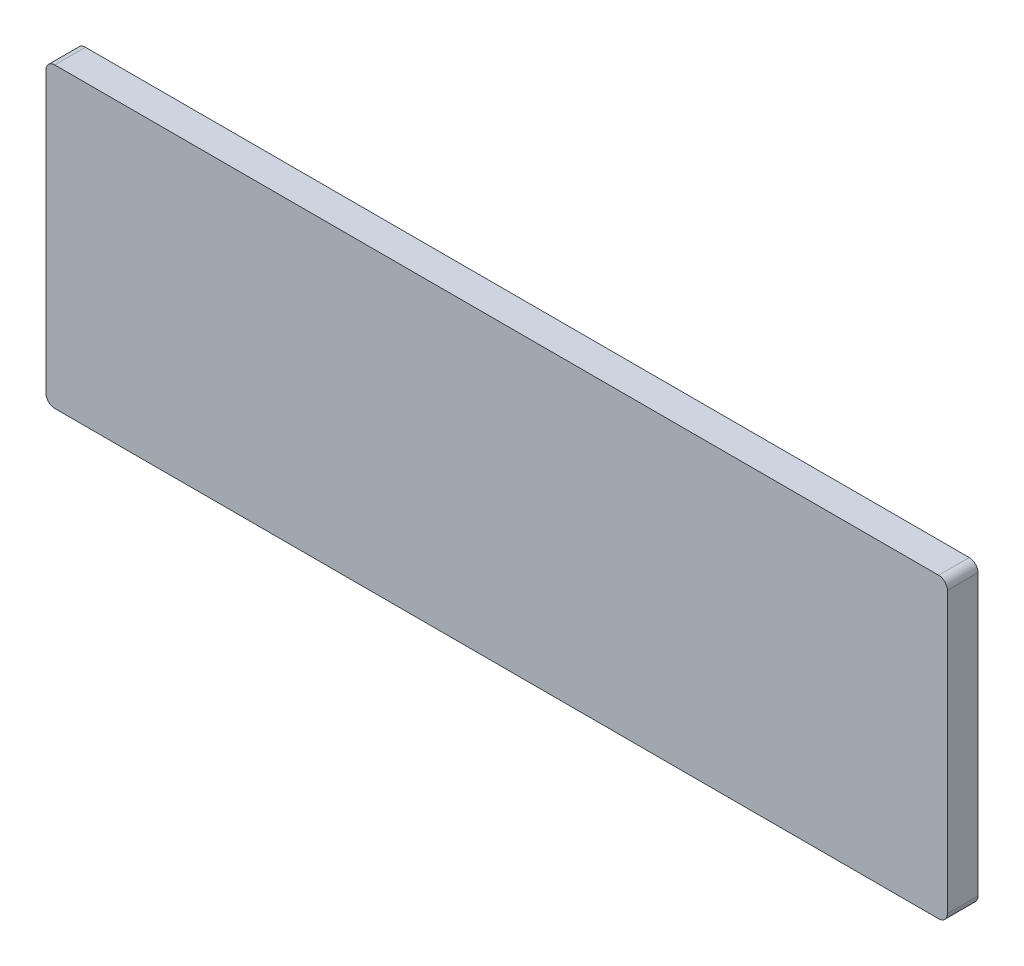
ISO-10303-21;
HEADER;
FILE_DESCRIPTION(('STEP AP214'),'2;1');
FILE_NAME('part.step','',(''),(''),'','','');
FILE_SCHEMA(('AUTOMOTIVE_DESIGN { 1 0 10303 214 1 1 1 1 }'));
ENDSEC;
DATA;
#1=APPLICATION_CONTEXT('core data for automotive mechanical design processes');
#2=APPLICATION_PROTOCOL_DEFINITION('international standard','automotive_design',2000,#1);
#3=PRODUCT_CONTEXT('',#1,'mechanical');
#4=PRODUCT('Part','Part','',(#3));
#5=PRODUCT_RELATED_PRODUCT_CATEGORY('part','',(#4));
#6=PRODUCT_DEFINITION_FORMATION('','',#4);
#7=PRODUCT_DEFINITION_CONTEXT('part definition',#1,'design');
#8=PRODUCT_DEFINITION('design','',#6,#7);
#9=PRODUCT_DEFINITION_SHAPE('','',#8);
#10=(LENGTH_UNIT() NAMED_UNIT(*) SI_UNIT(.MILLI.,.METRE.));
#11=(NAMED_UNIT(*) PLANE_ANGLE_UNIT() SI_UNIT($,.RADIAN.));
#12=(NAMED_UNIT(*) SI_UNIT($,.STERADIAN.) SOLID_ANGLE_UNIT());
#13=UNCERTAINTY_MEASURE_WITH_UNIT(LENGTH_MEASURE(1.E-05),#10,'distance_accuracy_value','');
#14=(GEOMETRIC_REPRESENTATION_CONTEXT(3) GLOBAL_UNCERTAINTY_ASSIGNED_CONTEXT((#13)) GLOBAL_UNIT_ASSIGNED_CONTEXT((#10,
#11,#12)) REPRESENTATION_CONTEXT('',''));
#15=CARTESIAN_POINT('',(0.,0.,0.));
#16=DIRECTION('',(0.,0.,1.));
#17=DIRECTION('',(1.,0.,0.));
#18=AXIS2_PLACEMENT_3D('',#15,#16,#17);
#19=CARTESIAN_POINT('',(101.,-32.,7.));
#20=DIRECTION('',(0.,0.,-1.));
#21=DIRECTION('',(-1.,0.,0.));
#22=AXIS2_PLACEMENT_3D('',#19,#20,#21);
#23=CYLINDRICAL_SURFACE('',#22,1.99999999999999);
#24=CARTESIAN_POINT('',(101.,-32.,0.));
#25=DIRECTION('',(0.,0.,1.));
#26=DIRECTION('',(1.,0.,0.));
#27=AXIS2_PLACEMENT_3D('',#24,#25,#26);
#28=CIRCLE('',#27,1.99999999999999);
#29=CARTESIAN_POINT('',(101.,-34.,0.));
#30=VERTEX_POINT('',#29);
#31=CARTESIAN_POINT('',(103.,-32.,0.));
#32=VERTEX_POINT('',#31);
#33=EDGE_CURVE('E130',#30,#32,#28,.T.);
#34=ORIENTED_EDGE('',*,*,#33,.T.);
#35=DIRECTION('',(0.,0.,-1.));
#36=VECTOR('',#35,1.);
#37=CARTESIAN_POINT('',(103.,-32.,7.));
#38=LINE('',#37,#36);
#39=CARTESIAN_POINT('',(103.,-32.,7.));
#40=VERTEX_POINT('',#39);
#41=EDGE_CURVE('E11',#40,#32,#38,.T.);
#42=ORIENTED_EDGE('',*,*,#41,.F.);
#43=CARTESIAN_POINT('',(101.,-32.,7.));
#44=DIRECTION('',(0.,0.,1.));
#45=DIRECTION('',(1.,0.,0.));
#46=AXIS2_PLACEMENT_3D('',#43,#44,#45);
#47=CIRCLE('',#46,1.99999999999999);
#48=CARTESIAN_POINT('',(101.,-34.,7.));
#49=VERTEX_POINT('',#48);
#50=EDGE_CURVE('E144',#49,#40,#47,.T.);
#51=ORIENTED_EDGE('',*,*,#50,.F.);
#52=DIRECTION('',(0.,0.,-1.));
#53=VECTOR('',#52,1.);
#54=CARTESIAN_POINT('',(101.,-34.,7.));
#55=LINE('',#54,#53);
#56=EDGE_CURVE('E126',#49,#30,#55,.T.);
#57=ORIENTED_EDGE('',*,*,#56,.T.);
#58=EDGE_LOOP('',(#34,#42,#51,#57));
#59=FACE_BOUND('',#58,.T.);
#60=ADVANCED_FACE('F34',(#59),#23,.T.);
#61=CARTESIAN_POINT('',(103.,32.,7.));
#62=DIRECTION('',(-1.,0.,0.));
#63=DIRECTION('',(0.,-1.,0.));
#64=AXIS2_PLACEMENT_3D('',#61,#62,#63);
#65=PLANE('',#64);
#66=DIRECTION('',(0.,1.,0.));
#67=VECTOR('',#66,1.);
#68=CARTESIAN_POINT('',(103.,32.,0.));
#69=LINE('',#68,#67);
#70=CARTESIAN_POINT('',(103.,32.,0.));
#71=VERTEX_POINT('',#70);
#72=EDGE_CURVE('E133',#32,#71,#69,.T.);
#73=ORIENTED_EDGE('',*,*,#72,.T.);
#74=DIRECTION('',(0.,0.,-1.));
#75=VECTOR('',#74,1.);
#76=CARTESIAN_POINT('',(103.,32.,7.));
#77=LINE('',#76,#75);
#78=CARTESIAN_POINT('',(103.,32.,7.));
#79=VERTEX_POINT('',#78);
#80=EDGE_CURVE('E42',#79,#71,#77,.T.);
#81=ORIENTED_EDGE('',*,*,#80,.F.);
#82=DIRECTION('',(0.,1.,0.));
#83=VECTOR('',#82,1.);
#84=CARTESIAN_POINT('',(103.,32.,7.));
#85=LINE('',#84,#83);
#86=EDGE_CURVE('E93',#40,#79,#85,.T.);
#87=ORIENTED_EDGE('',*,*,#86,.F.);
#88=ORIENTED_EDGE('',*,*,#41,.T.);
#89=EDGE_LOOP('',(#73,#81,#87,#88));
#90=FACE_BOUND('',#89,.T.);
#91=ADVANCED_FACE('F179',(#90),#65,.F.);
#92=CARTESIAN_POINT('',(101.,32.,7.));
#93=DIRECTION('',(0.,0.,-1.));
#94=DIRECTION('',(-1.,0.,0.));
#95=AXIS2_PLACEMENT_3D('',#92,#93,#94);
#96=CYLINDRICAL_SURFACE('',#95,1.99999999999999);
#97=CARTESIAN_POINT('',(101.,32.,0.));
#98=DIRECTION('',(0.,0.,1.));
#99=DIRECTION('',(-1.,0.,0.));
#100=AXIS2_PLACEMENT_3D('',#97,#98,#99);
#101=CIRCLE('',#100,1.99999999999999);
#102=CARTESIAN_POINT('',(101.,34.,0.));
#103=VERTEX_POINT('',#102);
#104=EDGE_CURVE('E135',#71,#103,#101,.T.);
#105=ORIENTED_EDGE('',*,*,#104,.T.);
#106=DIRECTION('',(0.,0.,-1.));
#107=VECTOR('',#106,1.);
#108=CARTESIAN_POINT('',(101.,34.,7.));
#109=LINE('',#108,#107);
#110=CARTESIAN_POINT('',(101.,34.,7.));
#111=VERTEX_POINT('',#110);
#112=EDGE_CURVE('E151',#111,#103,#109,.T.);
#113=ORIENTED_EDGE('',*,*,#112,.F.);
#114=CARTESIAN_POINT('',(101.,32.,7.));
#115=DIRECTION('',(0.,0.,1.));
#116=DIRECTION('',(-1.,0.,0.));
#117=AXIS2_PLACEMENT_3D('',#114,#115,#116);
#118=CIRCLE('',#117,1.99999999999999);
#119=EDGE_CURVE('E159',#79,#111,#118,.T.);
#120=ORIENTED_EDGE('',*,*,#119,.F.);
#121=ORIENTED_EDGE('',*,*,#80,.T.);
#122=EDGE_LOOP('',(#105,#113,#120,#121));
#123=FACE_BOUND('',#122,.T.);
#124=ADVANCED_FACE('F157',(#123),#96,.T.);
#125=CARTESIAN_POINT('',(-101.,34.,7.));
#126=DIRECTION('',(0.,-1.,0.));
#127=DIRECTION('',(0.,0.,-1.));
#128=AXIS2_PLACEMENT_3D('',#125,#126,#127);
#129=PLANE('',#128);
#130=DIRECTION('',(-1.,0.,0.));
#131=VECTOR('',#130,1.);
#132=CARTESIAN_POINT('',(-101.,34.,0.));
#133=LINE('',#132,#131);
#134=CARTESIAN_POINT('',(-101.,34.,0.));
#135=VERTEX_POINT('',#134);
#136=EDGE_CURVE('E137',#103,#135,#133,.T.);
#137=ORIENTED_EDGE('',*,*,#136,.T.);
#138=DIRECTION('',(0.,0.,-1.));
#139=VECTOR('',#138,1.);
#140=CARTESIAN_POINT('',(-101.,34.,7.));
#141=LINE('',#140,#139);
#142=CARTESIAN_POINT('',(-101.,34.,7.));
#143=VERTEX_POINT('',#142);
#144=EDGE_CURVE('E148',#143,#135,#141,.T.);
#145=ORIENTED_EDGE('',*,*,#144,.F.);
#146=DIRECTION('',(-1.,0.,0.));
#147=VECTOR('',#146,1.);
#148=CARTESIAN_POINT('',(-101.,34.,7.));
#149=LINE('',#148,#147);
#150=EDGE_CURVE('E171',#111,#143,#149,.T.);
#151=ORIENTED_EDGE('',*,*,#150,.F.);
#152=ORIENTED_EDGE('',*,*,#112,.T.);
#153=EDGE_LOOP('',(#137,#145,#151,#152));
#154=FACE_BOUND('',#153,.T.);
#155=ADVANCED_FACE('F167',(#154),#129,.F.);
#156=CARTESIAN_POINT('',(-101.,32.,7.));
#157=DIRECTION('',(0.,0.,-1.));
#158=DIRECTION('',(-1.,0.,0.));
#159=AXIS2_PLACEMENT_3D('',#156,#157,#158);
#160=CYLINDRICAL_SURFACE('',#159,2.);
#161=CARTESIAN_POINT('',(-101.,32.,0.));
#162=DIRECTION('',(0.,0.,1.));
#163=DIRECTION('',(1.,0.,0.));
#164=AXIS2_PLACEMENT_3D('',#161,#162,#163);
#165=CIRCLE('',#164,2.);
#166=CARTESIAN_POINT('',(-103.,32.,0.));
#167=VERTEX_POINT('',#166);
#168=EDGE_CURVE('E139',#135,#167,#165,.T.);
#169=ORIENTED_EDGE('',*,*,#168,.T.);
#170=DIRECTION('',(0.,0.,-1.));
#171=VECTOR('',#170,1.);
#172=CARTESIAN_POINT('',(-103.,32.,7.));
#173=LINE('',#172,#171);
#174=CARTESIAN_POINT('',(-103.,32.,7.));
#175=VERTEX_POINT('',#174);
#176=EDGE_CURVE('E121',#175,#167,#173,.T.);
#177=ORIENTED_EDGE('',*,*,#176,.F.);
#178=CARTESIAN_POINT('',(-101.,32.,7.));
#179=DIRECTION('',(0.,0.,1.));
#180=DIRECTION('',(1.,0.,0.));
#181=AXIS2_PLACEMENT_3D('',#178,#179,#180);
#182=CIRCLE('',#181,2.);
#183=EDGE_CURVE('E112',#143,#175,#182,.T.);
#184=ORIENTED_EDGE('',*,*,#183,.F.);
#185=ORIENTED_EDGE('',*,*,#144,.T.);
#186=EDGE_LOOP('',(#169,#177,#184,#185));
#187=FACE_BOUND('',#186,.T.);
#188=ADVANCED_FACE('F170',(#187),#160,.T.);
#189=CARTESIAN_POINT('',(-103.,32.,7.));
#190=DIRECTION('',(1.,0.,0.));
#191=DIRECTION('',(0.,1.,0.));
#192=AXIS2_PLACEMENT_3D('',#189,#190,#191);
#193=PLANE('',#192);
#194=DIRECTION('',(0.,-1.,0.));
#195=VECTOR('',#194,1.);
#196=CARTESIAN_POINT('',(-103.,32.,0.));
#197=LINE('',#196,#195);
#198=CARTESIAN_POINT('',(-103.,-32.,0.));
#199=VERTEX_POINT('',#198);
#200=EDGE_CURVE('E120',#167,#199,#197,.T.);
#201=ORIENTED_EDGE('',*,*,#200,.T.);
#202=DIRECTION('',(0.,0.,-1.));
#203=VECTOR('',#202,1.);
#204=CARTESIAN_POINT('',(-103.,-32.,7.));
#205=LINE('',#204,#203);
#206=CARTESIAN_POINT('',(-103.,-32.,7.));
#207=VERTEX_POINT('',#206);
#208=EDGE_CURVE('E117',#207,#199,#205,.T.);
#209=ORIENTED_EDGE('',*,*,#208,.F.);
#210=DIRECTION('',(0.,-1.,0.));
#211=VECTOR('',#210,1.);
#212=CARTESIAN_POINT('',(-103.,32.,7.));
#213=LINE('',#212,#211);
#214=EDGE_CURVE('E106',#175,#207,#213,.T.);
#215=ORIENTED_EDGE('',*,*,#214,.F.);
#216=ORIENTED_EDGE('',*,*,#176,.T.);
#217=EDGE_LOOP('',(#201,#209,#215,#216));
#218=FACE_BOUND('',#217,.T.);
#219=ADVANCED_FACE('F118',(#218),#193,.F.);
#220=CARTESIAN_POINT('',(-101.,-32.,7.));
#221=DIRECTION('',(0.,0.,-1.));
#222=DIRECTION('',(-1.,0.,0.));
#223=AXIS2_PLACEMENT_3D('',#220,#221,#222);
#224=CYLINDRICAL_SURFACE('',#223,1.99999999999999);
#225=CARTESIAN_POINT('',(-101.,-32.,0.));
#226=DIRECTION('',(0.,0.,1.));
#227=DIRECTION('',(1.,0.,0.));
#228=AXIS2_PLACEMENT_3D('',#225,#226,#227);
#229=CIRCLE('',#228,1.99999999999999);
#230=CARTESIAN_POINT('',(-101.,-34.,0.));
#231=VERTEX_POINT('',#230);
#232=EDGE_CURVE('E79',#199,#231,#229,.T.);
#233=ORIENTED_EDGE('',*,*,#232,.T.);
#234=DIRECTION('',(0.,0.,-1.));
#235=VECTOR('',#234,1.);
#236=CARTESIAN_POINT('',(-101.,-34.,7.));
#237=LINE('',#236,#235);
#238=CARTESIAN_POINT('',(-101.,-34.,7.));
#239=VERTEX_POINT('',#238);
#240=EDGE_CURVE('E122',#239,#231,#237,.T.);
#241=ORIENTED_EDGE('',*,*,#240,.F.);
#242=CARTESIAN_POINT('',(-101.,-32.,7.));
#243=DIRECTION('',(0.,0.,1.));
#244=DIRECTION('',(1.,0.,0.));
#245=AXIS2_PLACEMENT_3D('',#242,#243,#244);
#246=CIRCLE('',#245,1.99999999999999);
#247=EDGE_CURVE('E110',#207,#239,#246,.T.);
#248=ORIENTED_EDGE('',*,*,#247,.F.);
#249=ORIENTED_EDGE('',*,*,#208,.T.);
#250=EDGE_LOOP('',(#233,#241,#248,#249));
#251=FACE_BOUND('',#250,.T.);
#252=ADVANCED_FACE('F124',(#251),#224,.T.);
#253=CARTESIAN_POINT('',(-101.,-34.,7.));
#254=DIRECTION('',(0.,1.,0.));
#255=DIRECTION('',(0.,0.,1.));
#256=AXIS2_PLACEMENT_3D('',#253,#254,#255);
#257=PLANE('',#256);
#258=DIRECTION('',(1.,0.,0.));
#259=VECTOR('',#258,1.);
#260=CARTESIAN_POINT('',(-101.,-34.,0.));
#261=LINE('',#260,#259);
#262=EDGE_CURVE('E85',#231,#30,#261,.T.);
#263=ORIENTED_EDGE('',*,*,#262,.T.);
#264=ORIENTED_EDGE('',*,*,#56,.F.);
#265=DIRECTION('',(1.,0.,0.));
#266=VECTOR('',#265,1.);
#267=CARTESIAN_POINT('',(-101.,-34.,7.));
#268=LINE('',#267,#266);
#269=EDGE_CURVE('E50',#239,#49,#268,.T.);
#270=ORIENTED_EDGE('',*,*,#269,.F.);
#271=ORIENTED_EDGE('',*,*,#240,.T.);
#272=EDGE_LOOP('',(#263,#264,#270,#271));
#273=FACE_BOUND('',#272,.T.);
#274=ADVANCED_FACE('F195',(#273),#257,.F.);
#275=CARTESIAN_POINT('',(101.,-32.,7.));
#276=DIRECTION('',(0.,0.,1.));
#277=DIRECTION('',(1.,0.,0.));
#278=AXIS2_PLACEMENT_3D('',#275,#276,#277);
#279=PLANE('',#278);
#280=ORIENTED_EDGE('',*,*,#50,.T.);
#281=ORIENTED_EDGE('',*,*,#86,.T.);
#282=ORIENTED_EDGE('',*,*,#119,.T.);
#283=ORIENTED_EDGE('',*,*,#150,.T.);
#284=ORIENTED_EDGE('',*,*,#183,.T.);
#285=ORIENTED_EDGE('',*,*,#214,.T.);
#286=ORIENTED_EDGE('',*,*,#247,.T.);
#287=ORIENTED_EDGE('',*,*,#269,.T.);
#288=EDGE_LOOP('',(#280,#281,#282,#283,#284,#285,#286,#287));
#289=FACE_BOUND('',#288,.T.);
#290=ADVANCED_FACE('F108',(#289),#279,.T.);
#291=CARTESIAN_POINT('',(101.,-32.,0.));
#292=DIRECTION('',(0.,0.,1.));
#293=DIRECTION('',(1.,0.,0.));
#294=AXIS2_PLACEMENT_3D('',#291,#292,#293);
#295=PLANE('',#294);
#296=ORIENTED_EDGE('',*,*,#33,.F.);
#297=ORIENTED_EDGE('',*,*,#262,.F.);
#298=ORIENTED_EDGE('',*,*,#232,.F.);
#299=ORIENTED_EDGE('',*,*,#200,.F.);
#300=ORIENTED_EDGE('',*,*,#168,.F.);
#301=ORIENTED_EDGE('',*,*,#136,.F.);
#302=ORIENTED_EDGE('',*,*,#104,.F.);
#303=ORIENTED_EDGE('',*,*,#72,.F.);
#304=EDGE_LOOP('',(#296,#297,#298,#299,#300,#301,#302,#303));
#305=FACE_BOUND('',#304,.T.);
#306=ADVANCED_FACE('F163',(#305),#295,.F.);
#307=CLOSED_SHELL('',(#60,#91,#124,#155,#188,#219,#252,#274,#290,#306));
#308=MANIFOLD_SOLID_BREP('B2',#307);
#309=ADVANCED_BREP_SHAPE_REPRESENTATION('',(#18,#308),#14);
#310=SHAPE_DEFINITION_REPRESENTATION(#9,#309);
ENDSEC;
END-ISO-10303-21;
